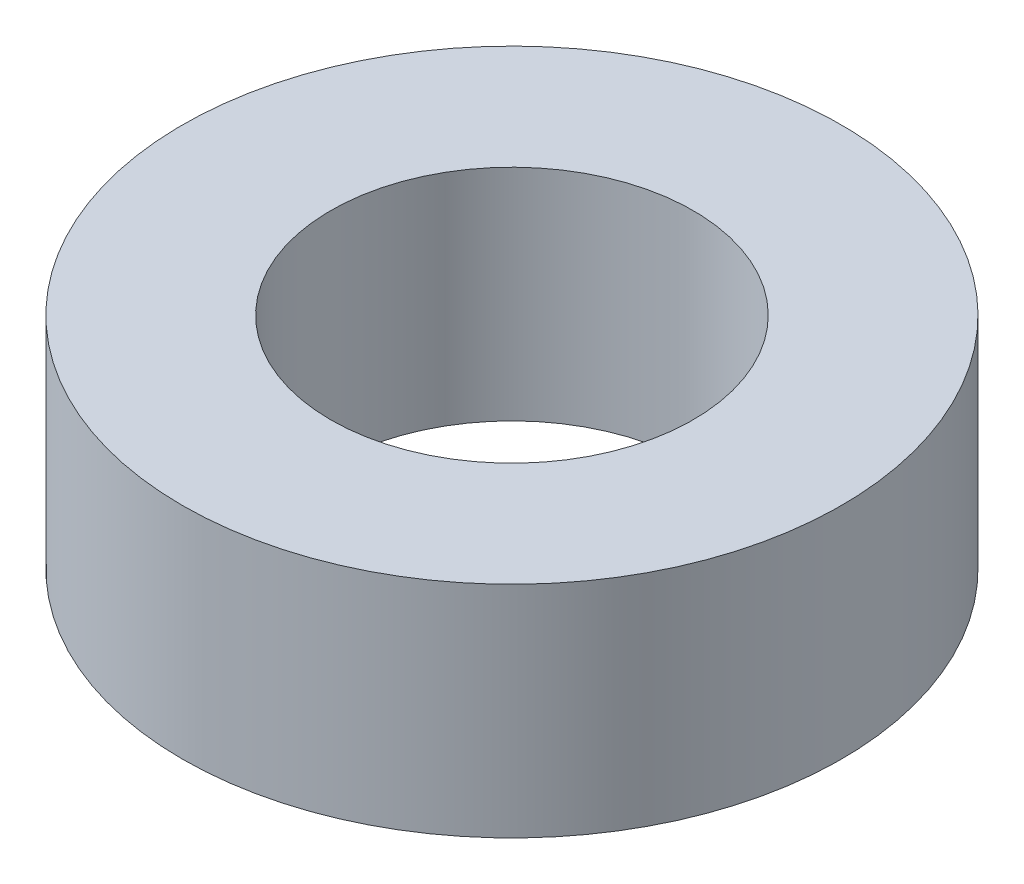
ISO-10303-21;
HEADER;
FILE_DESCRIPTION(('STEP AP214'),'2;1');
FILE_NAME('part.step','',(''),(''),'','','');
FILE_SCHEMA(('AUTOMOTIVE_DESIGN { 1 0 10303 214 1 1 1 1 }'));
ENDSEC;
DATA;
#1=APPLICATION_CONTEXT('core data for automotive mechanical design processes');
#2=APPLICATION_PROTOCOL_DEFINITION('international standard','automotive_design',2000,#1);
#3=PRODUCT_CONTEXT('',#1,'mechanical');
#4=PRODUCT('Part','Part','',(#3));
#5=PRODUCT_RELATED_PRODUCT_CATEGORY('part','',(#4));
#6=PRODUCT_DEFINITION_FORMATION('','',#4);
#7=PRODUCT_DEFINITION_CONTEXT('part definition',#1,'design');
#8=PRODUCT_DEFINITION('design','',#6,#7);
#9=PRODUCT_DEFINITION_SHAPE('','',#8);
#10=(LENGTH_UNIT() NAMED_UNIT(*) SI_UNIT(.MILLI.,.METRE.));
#11=(NAMED_UNIT(*) PLANE_ANGLE_UNIT() SI_UNIT($,.RADIAN.));
#12=(NAMED_UNIT(*) SI_UNIT($,.STERADIAN.) SOLID_ANGLE_UNIT());
#13=UNCERTAINTY_MEASURE_WITH_UNIT(LENGTH_MEASURE(1.E-05),#10,'distance_accuracy_value','');
#14=(GEOMETRIC_REPRESENTATION_CONTEXT(3) GLOBAL_UNCERTAINTY_ASSIGNED_CONTEXT((#13)) GLOBAL_UNIT_ASSIGNED_CONTEXT((#10,
#11,#12)) REPRESENTATION_CONTEXT('',''));
#15=CARTESIAN_POINT('',(0.,0.,0.));
#16=DIRECTION('',(0.,0.,1.));
#17=DIRECTION('',(1.,0.,0.));
#18=AXIS2_PLACEMENT_3D('',#15,#16,#17);
#19=CARTESIAN_POINT('',(0.,2.,0.));
#20=DIRECTION('',(0.,1.,0.));
#21=DIRECTION('',(0.,0.,1.));
#22=AXIS2_PLACEMENT_3D('',#19,#20,#21);
#23=PLANE('',#22);
#24=CARTESIAN_POINT('',(0.,2.,0.));
#25=DIRECTION('',(0.,1.,0.));
#26=DIRECTION('',(0.,0.,1.));
#27=AXIS2_PLACEMENT_3D('',#24,#25,#26);
#28=CIRCLE('',#27,3.);
#29=CARTESIAN_POINT('',(0.,2.,3.));
#30=VERTEX_POINT('',#29);
#31=EDGE_CURVE('E10',#30,#30,#28,.T.);
#32=ORIENTED_EDGE('',*,*,#31,.T.);
#33=EDGE_LOOP('',(#32));
#34=FACE_BOUND('',#33,.T.);
#35=CARTESIAN_POINT('',(0.,2.,0.));
#36=DIRECTION('',(0.,1.,0.));
#37=DIRECTION('',(0.,0.,1.));
#38=AXIS2_PLACEMENT_3D('',#35,#36,#37);
#39=CIRCLE('',#38,1.65);
#40=CARTESIAN_POINT('',(0.,2.,1.65));
#41=VERTEX_POINT('',#40);
#42=EDGE_CURVE('E43',#41,#41,#39,.T.);
#43=ORIENTED_EDGE('',*,*,#42,.F.);
#44=EDGE_LOOP('',(#43));
#45=FACE_BOUND('',#44,.T.);
#46=ADVANCED_FACE('F32',(#34,#45),#23,.T.);
#47=CARTESIAN_POINT('',(0.,0.,0.));
#48=DIRECTION('',(0.,1.,0.));
#49=DIRECTION('',(0.,0.,1.));
#50=AXIS2_PLACEMENT_3D('',#47,#48,#49);
#51=PLANE('',#50);
#52=CARTESIAN_POINT('',(0.,0.,0.));
#53=DIRECTION('',(0.,1.,0.));
#54=DIRECTION('',(0.,0.,1.));
#55=AXIS2_PLACEMENT_3D('',#52,#53,#54);
#56=CIRCLE('',#55,3.);
#57=CARTESIAN_POINT('',(0.,0.,3.));
#58=VERTEX_POINT('',#57);
#59=EDGE_CURVE('E36',#58,#58,#56,.T.);
#60=ORIENTED_EDGE('',*,*,#59,.F.);
#61=EDGE_LOOP('',(#60));
#62=FACE_BOUND('',#61,.T.);
#63=CARTESIAN_POINT('',(0.,0.,0.));
#64=DIRECTION('',(0.,1.,0.));
#65=DIRECTION('',(0.,0.,1.));
#66=AXIS2_PLACEMENT_3D('',#63,#64,#65);
#67=CIRCLE('',#66,1.65);
#68=CARTESIAN_POINT('',(0.,0.,1.65));
#69=VERTEX_POINT('',#68);
#70=EDGE_CURVE('E45',#69,#69,#67,.T.);
#71=ORIENTED_EDGE('',*,*,#70,.T.);
#72=EDGE_LOOP('',(#71));
#73=FACE_BOUND('',#72,.T.);
#74=ADVANCED_FACE('F55',(#62,#73),#51,.F.);
#75=CARTESIAN_POINT('',(0.,2.,0.));
#76=DIRECTION('',(0.,-1.,0.));
#77=DIRECTION('',(0.,0.,-1.));
#78=AXIS2_PLACEMENT_3D('',#75,#76,#77);
#79=CYLINDRICAL_SURFACE('',#78,3.);
#80=ORIENTED_EDGE('',*,*,#31,.F.);
#81=EDGE_LOOP('',(#80));
#82=FACE_BOUND('',#81,.T.);
#83=ORIENTED_EDGE('',*,*,#59,.T.);
#84=EDGE_LOOP('',(#83));
#85=FACE_BOUND('',#84,.T.);
#86=ADVANCED_FACE('F34',(#82,#85),#79,.T.);
#87=CARTESIAN_POINT('',(0.,2.,0.));
#88=DIRECTION('',(0.,-1.,0.));
#89=DIRECTION('',(0.,0.,-1.));
#90=AXIS2_PLACEMENT_3D('',#87,#88,#89);
#91=CYLINDRICAL_SURFACE('',#90,1.65);
#92=ORIENTED_EDGE('',*,*,#42,.T.);
#93=EDGE_LOOP('',(#92));
#94=FACE_BOUND('',#93,.T.);
#95=ORIENTED_EDGE('',*,*,#70,.F.);
#96=EDGE_LOOP('',(#95));
#97=FACE_BOUND('',#96,.T.);
#98=ADVANCED_FACE('F51',(#94,#97),#91,.F.);
#99=CLOSED_SHELL('',(#46,#74,#86,#98));
#100=MANIFOLD_SOLID_BREP('B2',#99);
#101=ADVANCED_BREP_SHAPE_REPRESENTATION('',(#18,#100),#14);
#102=SHAPE_DEFINITION_REPRESENTATION(#9,#101);
ENDSEC;
END-ISO-10303-21;
